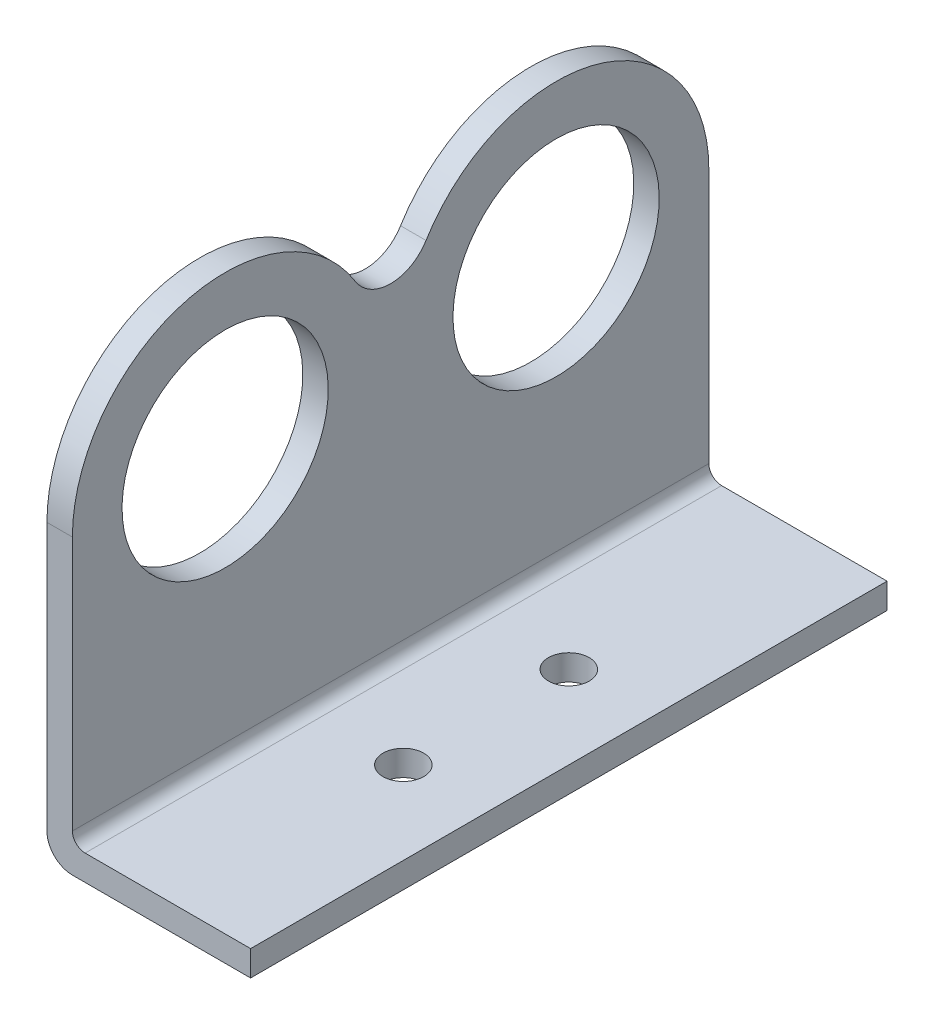
ISO-10303-21;
HEADER;
FILE_DESCRIPTION(('STEP AP214'),'2;1');
FILE_NAME('part.step','',(''),(''),'','','');
FILE_SCHEMA(('AUTOMOTIVE_DESIGN { 1 0 10303 214 1 1 1 1 }'));
ENDSEC;
DATA;
#1=APPLICATION_CONTEXT('core data for automotive mechanical design processes');
#2=APPLICATION_PROTOCOL_DEFINITION('international standard','automotive_design',2000,#1);
#3=PRODUCT_CONTEXT('',#1,'mechanical');
#4=PRODUCT('Part','Part','',(#3));
#5=PRODUCT_RELATED_PRODUCT_CATEGORY('part','',(#4));
#6=PRODUCT_DEFINITION_FORMATION('','',#4);
#7=PRODUCT_DEFINITION_CONTEXT('part definition',#1,'design');
#8=PRODUCT_DEFINITION('design','',#6,#7);
#9=PRODUCT_DEFINITION_SHAPE('','',#8);
#10=(LENGTH_UNIT() NAMED_UNIT(*) SI_UNIT(.MILLI.,.METRE.));
#11=(NAMED_UNIT(*) PLANE_ANGLE_UNIT() SI_UNIT($,.RADIAN.));
#12=(NAMED_UNIT(*) SI_UNIT($,.STERADIAN.) SOLID_ANGLE_UNIT());
#13=UNCERTAINTY_MEASURE_WITH_UNIT(LENGTH_MEASURE(1.E-05),#10,'distance_accuracy_value','');
#14=(GEOMETRIC_REPRESENTATION_CONTEXT(3) GLOBAL_UNCERTAINTY_ASSIGNED_CONTEXT((#13)) GLOBAL_UNIT_ASSIGNED_CONTEXT((#10,
#11,#12)) REPRESENTATION_CONTEXT('',''));
#15=CARTESIAN_POINT('',(0.,0.,0.));
#16=DIRECTION('',(0.,0.,1.));
#17=DIRECTION('',(1.,0.,0.));
#18=AXIS2_PLACEMENT_3D('',#15,#16,#17);
#19=CARTESIAN_POINT('',(0.,35.,50.));
#20=DIRECTION('',(1.,0.,0.));
#21=DIRECTION('',(0.,1.,0.));
#22=AXIS2_PLACEMENT_3D('',#19,#20,#21);
#23=PLANE('',#22);
#24=CARTESIAN_POINT('',(0.,23.,38.));
#25=DIRECTION('',(1.,0.,0.));
#26=DIRECTION('',(0.,1.,0.));
#27=AXIS2_PLACEMENT_3D('',#24,#25,#26);
#28=CIRCLE('',#27,8.1);
#29=CARTESIAN_POINT('',(0.,31.1,38.));
#30=VERTEX_POINT('',#29);
#31=EDGE_CURVE('E226',#30,#30,#28,.T.);
#32=ORIENTED_EDGE('',*,*,#31,.T.);
#33=EDGE_LOOP('',(#32));
#34=FACE_BOUND('',#33,.T.);
#35=CARTESIAN_POINT('',(0.,23.,12.));
#36=DIRECTION('',(1.,0.,0.));
#37=DIRECTION('',(0.,1.,0.));
#38=AXIS2_PLACEMENT_3D('',#35,#36,#37);
#39=CIRCLE('',#38,8.1);
#40=CARTESIAN_POINT('',(0.,31.1,12.));
#41=VERTEX_POINT('',#40);
#42=EDGE_CURVE('E223',#41,#41,#39,.T.);
#43=ORIENTED_EDGE('',*,*,#42,.T.);
#44=EDGE_LOOP('',(#43));
#45=FACE_BOUND('',#44,.T.);
#46=CARTESIAN_POINT('',(0.,23.,38.));
#47=DIRECTION('',(1.,0.,0.));
#48=DIRECTION('',(0.,1.,0.));
#49=AXIS2_PLACEMENT_3D('',#46,#47,#48);
#50=CIRCLE('',#49,12.);
#51=CARTESIAN_POINT('',(0.,29.289169107972,27.7801001995455));
#52=VERTEX_POINT('',#51);
#53=CARTESIAN_POINT('',(0.,23.,50.));
#54=VERTEX_POINT('',#53);
#55=EDGE_CURVE('E128',#52,#54,#50,.T.);
#56=ORIENTED_EDGE('',*,*,#55,.F.);
#57=CARTESIAN_POINT('',(0.,31.,25.));
#58=DIRECTION('',(1.,0.,0.));
#59=DIRECTION('',(0.,1.,0.));
#60=AXIS2_PLACEMENT_3D('',#57,#58,#59);
#61=CIRCLE('',#60,3.26433752247375);
#62=CARTESIAN_POINT('',(0.,29.289169107972,22.2198998004545));
#63=VERTEX_POINT('',#62);
#64=EDGE_CURVE('E205',#52,#63,#61,.T.);
#65=ORIENTED_EDGE('',*,*,#64,.T.);
#66=CARTESIAN_POINT('',(0.,23.,12.));
#67=DIRECTION('',(1.,0.,0.));
#68=DIRECTION('',(0.,1.,0.));
#69=AXIS2_PLACEMENT_3D('',#66,#67,#68);
#70=CIRCLE('',#69,12.);
#71=CARTESIAN_POINT('',(0.,23.,0.));
#72=VERTEX_POINT('',#71);
#73=EDGE_CURVE('E217',#72,#63,#70,.T.);
#74=ORIENTED_EDGE('',*,*,#73,.F.);
#75=DIRECTION('',(0.,-1.,0.));
#76=VECTOR('',#75,1.);
#77=CARTESIAN_POINT('',(0.,35.,0.));
#78=LINE('',#77,#76);
#79=CARTESIAN_POINT('',(0.,2.00000000000001,0.));
#80=VERTEX_POINT('',#79);
#81=EDGE_CURVE('E241',#72,#80,#78,.T.);
#82=ORIENTED_EDGE('',*,*,#81,.T.);
#83=DIRECTION('',(0.,0.,-1.));
#84=VECTOR('',#83,1.);
#85=CARTESIAN_POINT('',(0.,2.00000000000001,50.));
#86=LINE('',#85,#84);
#87=CARTESIAN_POINT('',(0.,2.00000000000001,50.));
#88=VERTEX_POINT('',#87);
#89=EDGE_CURVE('E284',#88,#80,#86,.T.);
#90=ORIENTED_EDGE('',*,*,#89,.F.);
#91=DIRECTION('',(0.,-1.,0.));
#92=VECTOR('',#91,1.);
#93=CARTESIAN_POINT('',(0.,35.,50.));
#94=LINE('',#93,#92);
#95=EDGE_CURVE('E242',#54,#88,#94,.T.);
#96=ORIENTED_EDGE('',*,*,#95,.F.);
#97=EDGE_LOOP('',(#56,#65,#74,#82,#90,#96));
#98=FACE_BOUND('',#97,.T.);
#99=ADVANCED_FACE('F115',(#34,#45,#98),#23,.F.);
#100=CARTESIAN_POINT('',(1.99999999999999,3.00000000000001,50.));
#101=DIRECTION('',(-1.,0.,0.));
#102=DIRECTION('',(0.,-1.,0.));
#103=AXIS2_PLACEMENT_3D('',#100,#101,#102);
#104=PLANE('',#103);
#105=CARTESIAN_POINT('',(1.99999999999999,23.,38.));
#106=DIRECTION('',(1.,0.,0.));
#107=DIRECTION('',(0.,1.,0.));
#108=AXIS2_PLACEMENT_3D('',#105,#106,#107);
#109=CIRCLE('',#108,8.1);
#110=CARTESIAN_POINT('',(1.99999999999999,31.1,38.));
#111=VERTEX_POINT('',#110);
#112=EDGE_CURVE('E196',#111,#111,#109,.T.);
#113=ORIENTED_EDGE('',*,*,#112,.F.);
#114=EDGE_LOOP('',(#113));
#115=FACE_BOUND('',#114,.T.);
#116=CARTESIAN_POINT('',(1.99999999999999,23.,12.));
#117=DIRECTION('',(1.,0.,0.));
#118=DIRECTION('',(0.,1.,0.));
#119=AXIS2_PLACEMENT_3D('',#116,#117,#118);
#120=CIRCLE('',#119,8.1);
#121=CARTESIAN_POINT('',(1.99999999999999,31.1,12.));
#122=VERTEX_POINT('',#121);
#123=EDGE_CURVE('E215',#122,#122,#120,.T.);
#124=ORIENTED_EDGE('',*,*,#123,.F.);
#125=EDGE_LOOP('',(#124));
#126=FACE_BOUND('',#125,.T.);
#127=CARTESIAN_POINT('',(1.99999999999999,31.,25.));
#128=DIRECTION('',(1.,0.,0.));
#129=DIRECTION('',(0.,1.,0.));
#130=AXIS2_PLACEMENT_3D('',#127,#128,#129);
#131=CIRCLE('',#130,3.26433752247375);
#132=CARTESIAN_POINT('',(1.99999999999999,29.289169107972,27.7801001995455));
#133=VERTEX_POINT('',#132);
#134=CARTESIAN_POINT('',(1.99999999999999,29.289169107972,22.2198998004545));
#135=VERTEX_POINT('',#134);
#136=EDGE_CURVE('E203',#133,#135,#131,.T.);
#137=ORIENTED_EDGE('',*,*,#136,.F.);
#138=CARTESIAN_POINT('',(1.99999999999999,23.,38.));
#139=DIRECTION('',(1.,0.,0.));
#140=DIRECTION('',(0.,1.,0.));
#141=AXIS2_PLACEMENT_3D('',#138,#139,#140);
#142=CIRCLE('',#141,12.);
#143=CARTESIAN_POINT('',(1.99999999999999,23.,50.));
#144=VERTEX_POINT('',#143);
#145=EDGE_CURVE('E188',#133,#144,#142,.T.);
#146=ORIENTED_EDGE('',*,*,#145,.T.);
#147=DIRECTION('',(0.,1.,0.));
#148=VECTOR('',#147,1.);
#149=CARTESIAN_POINT('',(1.99999999999999,3.00000000000001,50.));
#150=LINE('',#149,#148);
#151=CARTESIAN_POINT('',(1.99999999999999,3.00000000000001,50.));
#152=VERTEX_POINT('',#151);
#153=EDGE_CURVE('E255',#152,#144,#150,.T.);
#154=ORIENTED_EDGE('',*,*,#153,.F.);
#155=DIRECTION('',(0.,0.,-1.));
#156=VECTOR('',#155,1.);
#157=CARTESIAN_POINT('',(1.99999999999999,3.00000000000001,50.));
#158=LINE('',#157,#156);
#159=CARTESIAN_POINT('',(1.99999999999999,3.00000000000001,0.));
#160=VERTEX_POINT('',#159);
#161=EDGE_CURVE('E257',#152,#160,#158,.T.);
#162=ORIENTED_EDGE('',*,*,#161,.T.);
#163=DIRECTION('',(0.,1.,0.));
#164=VECTOR('',#163,1.);
#165=CARTESIAN_POINT('',(1.99999999999999,3.00000000000001,0.));
#166=LINE('',#165,#164);
#167=CARTESIAN_POINT('',(1.99999999999999,23.,0.));
#168=VERTEX_POINT('',#167);
#169=EDGE_CURVE('E245',#160,#168,#166,.T.);
#170=ORIENTED_EDGE('',*,*,#169,.T.);
#171=CARTESIAN_POINT('',(1.99999999999999,23.,12.));
#172=DIRECTION('',(1.,0.,0.));
#173=DIRECTION('',(0.,1.,0.));
#174=AXIS2_PLACEMENT_3D('',#171,#172,#173);
#175=CIRCLE('',#174,12.);
#176=EDGE_CURVE('E136',#168,#135,#175,.T.);
#177=ORIENTED_EDGE('',*,*,#176,.T.);
#178=EDGE_LOOP('',(#137,#146,#154,#162,#170,#177));
#179=FACE_BOUND('',#178,.T.);
#180=ADVANCED_FACE('F208',(#115,#126,#179),#104,.F.);
#181=CARTESIAN_POINT('',(2.,2.,50.));
#182=DIRECTION('',(0.,0.,-1.));
#183=DIRECTION('',(-1.,0.,0.));
#184=AXIS2_PLACEMENT_3D('',#181,#182,#183);
#185=CYLINDRICAL_SURFACE('',#184,2.);
#186=CARTESIAN_POINT('',(2.,2.,0.));
#187=DIRECTION('',(0.,0.,1.));
#188=DIRECTION('',(1.,0.,0.));
#189=AXIS2_PLACEMENT_3D('',#186,#187,#188);
#190=CIRCLE('',#189,2.);
#191=CARTESIAN_POINT('',(2.00000000000001,0.,0.));
#192=VERTEX_POINT('',#191);
#193=EDGE_CURVE('E259',#80,#192,#190,.T.);
#194=ORIENTED_EDGE('',*,*,#193,.T.);
#195=DIRECTION('',(0.,0.,-1.));
#196=VECTOR('',#195,1.);
#197=CARTESIAN_POINT('',(2.00000000000001,0.,50.));
#198=LINE('',#197,#196);
#199=CARTESIAN_POINT('',(2.00000000000001,0.,50.));
#200=VERTEX_POINT('',#199);
#201=EDGE_CURVE('E281',#200,#192,#198,.T.);
#202=ORIENTED_EDGE('',*,*,#201,.F.);
#203=CARTESIAN_POINT('',(2.,2.,50.));
#204=DIRECTION('',(0.,0.,1.));
#205=DIRECTION('',(1.,0.,0.));
#206=AXIS2_PLACEMENT_3D('',#203,#204,#205);
#207=CIRCLE('',#206,2.);
#208=EDGE_CURVE('E244',#88,#200,#207,.T.);
#209=ORIENTED_EDGE('',*,*,#208,.F.);
#210=ORIENTED_EDGE('',*,*,#89,.T.);
#211=EDGE_LOOP('',(#194,#202,#209,#210));
#212=FACE_BOUND('',#211,.T.);
#213=ADVANCED_FACE('F314',(#212),#185,.T.);
#214=CARTESIAN_POINT('',(2.00000000000001,0.,50.));
#215=DIRECTION('',(0.,1.,0.));
#216=DIRECTION('',(0.,0.,1.));
#217=AXIS2_PLACEMENT_3D('',#214,#215,#216);
#218=PLANE('',#217);
#219=CARTESIAN_POINT('',(9.5,0.,18.5));
#220=DIRECTION('',(0.,1.,0.));
#221=DIRECTION('',(0.,0.,1.));
#222=AXIS2_PLACEMENT_3D('',#219,#220,#221);
#223=CIRCLE('',#222,1.6);
#224=CARTESIAN_POINT('',(9.5,0.,20.1));
#225=VERTEX_POINT('',#224);
#226=EDGE_CURVE('E238',#225,#225,#223,.T.);
#227=ORIENTED_EDGE('',*,*,#226,.T.);
#228=EDGE_LOOP('',(#227));
#229=FACE_BOUND('',#228,.T.);
#230=CARTESIAN_POINT('',(9.5,0.,31.5));
#231=DIRECTION('',(0.,1.,0.));
#232=DIRECTION('',(0.,0.,1.));
#233=AXIS2_PLACEMENT_3D('',#230,#231,#232);
#234=CIRCLE('',#233,1.6);
#235=CARTESIAN_POINT('',(9.5,0.,33.1));
#236=VERTEX_POINT('',#235);
#237=EDGE_CURVE('E233',#236,#236,#234,.T.);
#238=ORIENTED_EDGE('',*,*,#237,.T.);
#239=EDGE_LOOP('',(#238));
#240=FACE_BOUND('',#239,.T.);
#241=DIRECTION('',(1.,0.,0.));
#242=VECTOR('',#241,1.);
#243=CARTESIAN_POINT('',(2.00000000000001,0.,0.));
#244=LINE('',#243,#242);
#245=CARTESIAN_POINT('',(16.,0.,0.));
#246=VERTEX_POINT('',#245);
#247=EDGE_CURVE('E261',#192,#246,#244,.T.);
#248=ORIENTED_EDGE('',*,*,#247,.T.);
#249=DIRECTION('',(0.,0.,-1.));
#250=VECTOR('',#249,1.);
#251=CARTESIAN_POINT('',(16.,0.,50.));
#252=LINE('',#251,#250);
#253=CARTESIAN_POINT('',(16.,0.,50.));
#254=VERTEX_POINT('',#253);
#255=EDGE_CURVE('E278',#254,#246,#252,.T.);
#256=ORIENTED_EDGE('',*,*,#255,.F.);
#257=DIRECTION('',(1.,0.,0.));
#258=VECTOR('',#257,1.);
#259=CARTESIAN_POINT('',(2.00000000000001,0.,50.));
#260=LINE('',#259,#258);
#261=EDGE_CURVE('E247',#200,#254,#260,.T.);
#262=ORIENTED_EDGE('',*,*,#261,.F.);
#263=ORIENTED_EDGE('',*,*,#201,.T.);
#264=EDGE_LOOP('',(#248,#256,#262,#263));
#265=FACE_BOUND('',#264,.T.);
#266=ADVANCED_FACE('F311',(#229,#240,#265),#218,.F.);
#267=CARTESIAN_POINT('',(16.,0.,50.));
#268=DIRECTION('',(-1.,0.,0.));
#269=DIRECTION('',(0.,-1.,0.));
#270=AXIS2_PLACEMENT_3D('',#267,#268,#269);
#271=PLANE('',#270);
#272=DIRECTION('',(0.,1.,0.));
#273=VECTOR('',#272,1.);
#274=CARTESIAN_POINT('',(16.,0.,0.));
#275=LINE('',#274,#273);
#276=CARTESIAN_POINT('',(16.,2.,0.));
#277=VERTEX_POINT('',#276);
#278=EDGE_CURVE('E263',#246,#277,#275,.T.);
#279=ORIENTED_EDGE('',*,*,#278,.T.);
#280=DIRECTION('',(0.,0.,-1.));
#281=VECTOR('',#280,1.);
#282=CARTESIAN_POINT('',(16.,2.,50.));
#283=LINE('',#282,#281);
#284=CARTESIAN_POINT('',(16.,2.,50.));
#285=VERTEX_POINT('',#284);
#286=EDGE_CURVE('E275',#285,#277,#283,.T.);
#287=ORIENTED_EDGE('',*,*,#286,.F.);
#288=DIRECTION('',(0.,1.,0.));
#289=VECTOR('',#288,1.);
#290=CARTESIAN_POINT('',(16.,0.,50.));
#291=LINE('',#290,#289);
#292=EDGE_CURVE('E249',#254,#285,#291,.T.);
#293=ORIENTED_EDGE('',*,*,#292,.F.);
#294=ORIENTED_EDGE('',*,*,#255,.T.);
#295=EDGE_LOOP('',(#279,#287,#293,#294));
#296=FACE_BOUND('',#295,.T.);
#297=ADVANCED_FACE('F307',(#296),#271,.F.);
#298=CARTESIAN_POINT('',(16.,2.,50.));
#299=DIRECTION('',(0.,-1.,0.));
#300=DIRECTION('',(0.,0.,-1.));
#301=AXIS2_PLACEMENT_3D('',#298,#299,#300);
#302=PLANE('',#301);
#303=CARTESIAN_POINT('',(9.5,2.,18.5));
#304=DIRECTION('',(0.,1.,0.));
#305=DIRECTION('',(0.,0.,1.));
#306=AXIS2_PLACEMENT_3D('',#303,#304,#305);
#307=CIRCLE('',#306,1.6);
#308=CARTESIAN_POINT('',(9.5,2.,20.1));
#309=VERTEX_POINT('',#308);
#310=EDGE_CURVE('E230',#309,#309,#307,.T.);
#311=ORIENTED_EDGE('',*,*,#310,.F.);
#312=EDGE_LOOP('',(#311));
#313=FACE_BOUND('',#312,.T.);
#314=CARTESIAN_POINT('',(9.5,2.,31.5));
#315=DIRECTION('',(0.,1.,0.));
#316=DIRECTION('',(0.,0.,1.));
#317=AXIS2_PLACEMENT_3D('',#314,#315,#316);
#318=CIRCLE('',#317,1.6);
#319=CARTESIAN_POINT('',(9.5,2.,33.1));
#320=VERTEX_POINT('',#319);
#321=EDGE_CURVE('E229',#320,#320,#318,.T.);
#322=ORIENTED_EDGE('',*,*,#321,.F.);
#323=EDGE_LOOP('',(#322));
#324=FACE_BOUND('',#323,.T.);
#325=DIRECTION('',(-1.,0.,0.));
#326=VECTOR('',#325,1.);
#327=CARTESIAN_POINT('',(16.,2.,0.));
#328=LINE('',#327,#326);
#329=CARTESIAN_POINT('',(3.,2.,0.));
#330=VERTEX_POINT('',#329);
#331=EDGE_CURVE('E265',#277,#330,#328,.T.);
#332=ORIENTED_EDGE('',*,*,#331,.T.);
#333=DIRECTION('',(0.,0.,-1.));
#334=VECTOR('',#333,1.);
#335=CARTESIAN_POINT('',(3.,2.,50.));
#336=LINE('',#335,#334);
#337=CARTESIAN_POINT('',(3.,2.,50.));
#338=VERTEX_POINT('',#337);
#339=EDGE_CURVE('E272',#338,#330,#336,.T.);
#340=ORIENTED_EDGE('',*,*,#339,.F.);
#341=DIRECTION('',(-1.,0.,0.));
#342=VECTOR('',#341,1.);
#343=CARTESIAN_POINT('',(16.,2.,50.));
#344=LINE('',#343,#342);
#345=EDGE_CURVE('E251',#285,#338,#344,.T.);
#346=ORIENTED_EDGE('',*,*,#345,.F.);
#347=ORIENTED_EDGE('',*,*,#286,.T.);
#348=EDGE_LOOP('',(#332,#340,#346,#347));
#349=FACE_BOUND('',#348,.T.);
#350=ADVANCED_FACE('F302',(#313,#324,#349),#302,.F.);
#351=CARTESIAN_POINT('',(2.99999999999999,3.,50.));
#352=DIRECTION('',(0.,0.,-1.));
#353=DIRECTION('',(-1.,0.,0.));
#354=AXIS2_PLACEMENT_3D('',#351,#352,#353);
#355=CYLINDRICAL_SURFACE('',#354,1.);
#356=CARTESIAN_POINT('',(2.99999999999999,3.,0.));
#357=DIRECTION('',(0.,0.,-1.));
#358=DIRECTION('',(1.,0.,0.));
#359=AXIS2_PLACEMENT_3D('',#356,#357,#358);
#360=CIRCLE('',#359,1.);
#361=EDGE_CURVE('E267',#330,#160,#360,.T.);
#362=ORIENTED_EDGE('',*,*,#361,.T.);
#363=ORIENTED_EDGE('',*,*,#161,.F.);
#364=CARTESIAN_POINT('',(2.99999999999999,3.,50.));
#365=DIRECTION('',(0.,0.,-1.));
#366=DIRECTION('',(1.,0.,0.));
#367=AXIS2_PLACEMENT_3D('',#364,#365,#366);
#368=CIRCLE('',#367,1.);
#369=EDGE_CURVE('E253',#338,#152,#368,.T.);
#370=ORIENTED_EDGE('',*,*,#369,.F.);
#371=ORIENTED_EDGE('',*,*,#339,.T.);
#372=EDGE_LOOP('',(#362,#363,#370,#371));
#373=FACE_BOUND('',#372,.T.);
#374=ADVANCED_FACE('F296',(#373),#355,.F.);
#375=CARTESIAN_POINT('',(2.,2.,50.));
#376=DIRECTION('',(0.,0.,1.));
#377=DIRECTION('',(1.,0.,0.));
#378=AXIS2_PLACEMENT_3D('',#375,#376,#377);
#379=PLANE('',#378);
#380=DIRECTION('',(1.,0.,0.));
#381=VECTOR('',#380,1.);
#382=CARTESIAN_POINT('',(-48.,23.,50.));
#383=LINE('',#382,#381);
#384=EDGE_CURVE('E12',#54,#144,#383,.T.);
#385=ORIENTED_EDGE('',*,*,#384,.F.);
#386=ORIENTED_EDGE('',*,*,#95,.T.);
#387=ORIENTED_EDGE('',*,*,#208,.T.);
#388=ORIENTED_EDGE('',*,*,#261,.T.);
#389=ORIENTED_EDGE('',*,*,#292,.T.);
#390=ORIENTED_EDGE('',*,*,#345,.T.);
#391=ORIENTED_EDGE('',*,*,#369,.T.);
#392=ORIENTED_EDGE('',*,*,#153,.T.);
#393=EDGE_LOOP('',(#385,#386,#387,#388,#389,#390,#391,#392));
#394=FACE_BOUND('',#393,.T.);
#395=ADVANCED_FACE('F358',(#394),#379,.T.);
#396=CARTESIAN_POINT('',(2.,2.,0.));
#397=DIRECTION('',(0.,0.,1.));
#398=DIRECTION('',(1.,0.,0.));
#399=AXIS2_PLACEMENT_3D('',#396,#397,#398);
#400=PLANE('',#399);
#401=ORIENTED_EDGE('',*,*,#81,.F.);
#402=DIRECTION('',(1.,0.,0.));
#403=VECTOR('',#402,1.);
#404=CARTESIAN_POINT('',(-48.,23.,0.));
#405=LINE('',#404,#403);
#406=EDGE_CURVE('E122',#72,#168,#405,.T.);
#407=ORIENTED_EDGE('',*,*,#406,.T.);
#408=ORIENTED_EDGE('',*,*,#169,.F.);
#409=ORIENTED_EDGE('',*,*,#361,.F.);
#410=ORIENTED_EDGE('',*,*,#331,.F.);
#411=ORIENTED_EDGE('',*,*,#278,.F.);
#412=ORIENTED_EDGE('',*,*,#247,.F.);
#413=ORIENTED_EDGE('',*,*,#193,.F.);
#414=EDGE_LOOP('',(#401,#407,#408,#409,#410,#411,#412,#413));
#415=FACE_BOUND('',#414,.T.);
#416=ADVANCED_FACE('F289',(#415),#400,.F.);
#417=CARTESIAN_POINT('',(9.5,-48.,31.5));
#418=DIRECTION('',(0.,1.,0.));
#419=DIRECTION('',(0.,0.,1.));
#420=AXIS2_PLACEMENT_3D('',#417,#418,#419);
#421=CYLINDRICAL_SURFACE('',#420,1.6);
#422=ORIENTED_EDGE('',*,*,#321,.T.);
#423=EDGE_LOOP('',(#422));
#424=FACE_BOUND('',#423,.T.);
#425=ORIENTED_EDGE('',*,*,#237,.F.);
#426=EDGE_LOOP('',(#425));
#427=FACE_BOUND('',#426,.T.);
#428=ADVANCED_FACE('F330',(#424,#427),#421,.F.);
#429=CARTESIAN_POINT('',(9.5,-48.,18.5));
#430=DIRECTION('',(0.,1.,0.));
#431=DIRECTION('',(0.,0.,1.));
#432=AXIS2_PLACEMENT_3D('',#429,#430,#431);
#433=CYLINDRICAL_SURFACE('',#432,1.6);
#434=ORIENTED_EDGE('',*,*,#310,.T.);
#435=EDGE_LOOP('',(#434));
#436=FACE_BOUND('',#435,.T.);
#437=ORIENTED_EDGE('',*,*,#226,.F.);
#438=EDGE_LOOP('',(#437));
#439=FACE_BOUND('',#438,.T.);
#440=ADVANCED_FACE('F321',(#436,#439),#433,.F.);
#441=CARTESIAN_POINT('',(-48.,23.,12.));
#442=DIRECTION('',(1.,0.,0.));
#443=DIRECTION('',(0.,1.,0.));
#444=AXIS2_PLACEMENT_3D('',#441,#442,#443);
#445=CYLINDRICAL_SURFACE('',#444,12.);
#446=ORIENTED_EDGE('',*,*,#73,.T.);
#447=DIRECTION('',(1.,0.,0.));
#448=VECTOR('',#447,1.);
#449=CARTESIAN_POINT('',(-48.,29.289169107972,22.2198998004545));
#450=LINE('',#449,#448);
#451=EDGE_CURVE('E206',#63,#135,#450,.T.);
#452=ORIENTED_EDGE('',*,*,#451,.T.);
#453=ORIENTED_EDGE('',*,*,#176,.F.);
#454=ORIENTED_EDGE('',*,*,#406,.F.);
#455=EDGE_LOOP('',(#446,#452,#453,#454));
#456=FACE_BOUND('',#455,.T.);
#457=ADVANCED_FACE('F319',(#456),#445,.T.);
#458=CARTESIAN_POINT('',(-48.,23.,38.));
#459=DIRECTION('',(1.,0.,0.));
#460=DIRECTION('',(0.,1.,0.));
#461=AXIS2_PLACEMENT_3D('',#458,#459,#460);
#462=CYLINDRICAL_SURFACE('',#461,12.);
#463=ORIENTED_EDGE('',*,*,#55,.T.);
#464=ORIENTED_EDGE('',*,*,#384,.T.);
#465=ORIENTED_EDGE('',*,*,#145,.F.);
#466=DIRECTION('',(1.,0.,0.));
#467=VECTOR('',#466,1.);
#468=CARTESIAN_POINT('',(-48.,29.289169107972,27.7801001995455));
#469=LINE('',#468,#467);
#470=EDGE_CURVE('E191',#52,#133,#469,.T.);
#471=ORIENTED_EDGE('',*,*,#470,.F.);
#472=EDGE_LOOP('',(#463,#464,#465,#471));
#473=FACE_BOUND('',#472,.T.);
#474=ADVANCED_FACE('F190',(#473),#462,.T.);
#475=CARTESIAN_POINT('',(-48.,23.,12.));
#476=DIRECTION('',(1.,0.,0.));
#477=DIRECTION('',(0.,1.,0.));
#478=AXIS2_PLACEMENT_3D('',#475,#476,#477);
#479=CYLINDRICAL_SURFACE('',#478,8.1);
#480=ORIENTED_EDGE('',*,*,#123,.T.);
#481=EDGE_LOOP('',(#480));
#482=FACE_BOUND('',#481,.T.);
#483=ORIENTED_EDGE('',*,*,#42,.F.);
#484=EDGE_LOOP('',(#483));
#485=FACE_BOUND('',#484,.T.);
#486=ADVANCED_FACE('F327',(#482,#485),#479,.F.);
#487=CARTESIAN_POINT('',(-48.,23.,38.));
#488=DIRECTION('',(1.,0.,0.));
#489=DIRECTION('',(0.,1.,0.));
#490=AXIS2_PLACEMENT_3D('',#487,#488,#489);
#491=CYLINDRICAL_SURFACE('',#490,8.1);
#492=ORIENTED_EDGE('',*,*,#112,.T.);
#493=EDGE_LOOP('',(#492));
#494=FACE_BOUND('',#493,.T.);
#495=ORIENTED_EDGE('',*,*,#31,.F.);
#496=EDGE_LOOP('',(#495));
#497=FACE_BOUND('',#496,.T.);
#498=ADVANCED_FACE('F347',(#494,#497),#491,.F.);
#499=CARTESIAN_POINT('',(-48.,31.,25.));
#500=DIRECTION('',(1.,0.,0.));
#501=DIRECTION('',(0.,1.,0.));
#502=AXIS2_PLACEMENT_3D('',#499,#500,#501);
#503=CYLINDRICAL_SURFACE('',#502,3.26433752247375);
#504=ORIENTED_EDGE('',*,*,#470,.T.);
#505=ORIENTED_EDGE('',*,*,#136,.T.);
#506=ORIENTED_EDGE('',*,*,#451,.F.);
#507=ORIENTED_EDGE('',*,*,#64,.F.);
#508=EDGE_LOOP('',(#504,#505,#506,#507));
#509=FACE_BOUND('',#508,.T.);
#510=ADVANCED_FACE('F201',(#509),#503,.F.);
#511=CLOSED_SHELL('',(#99,#180,#213,#266,#297,#350,#374,#395,#416,#428,#440,#457,#474,#486,#498,#510));
#512=MANIFOLD_SOLID_BREP('B2',#511);
#513=ADVANCED_BREP_SHAPE_REPRESENTATION('',(#18,#512),#14);
#514=SHAPE_DEFINITION_REPRESENTATION(#9,#513);
ENDSEC;
END-ISO-10303-21;
